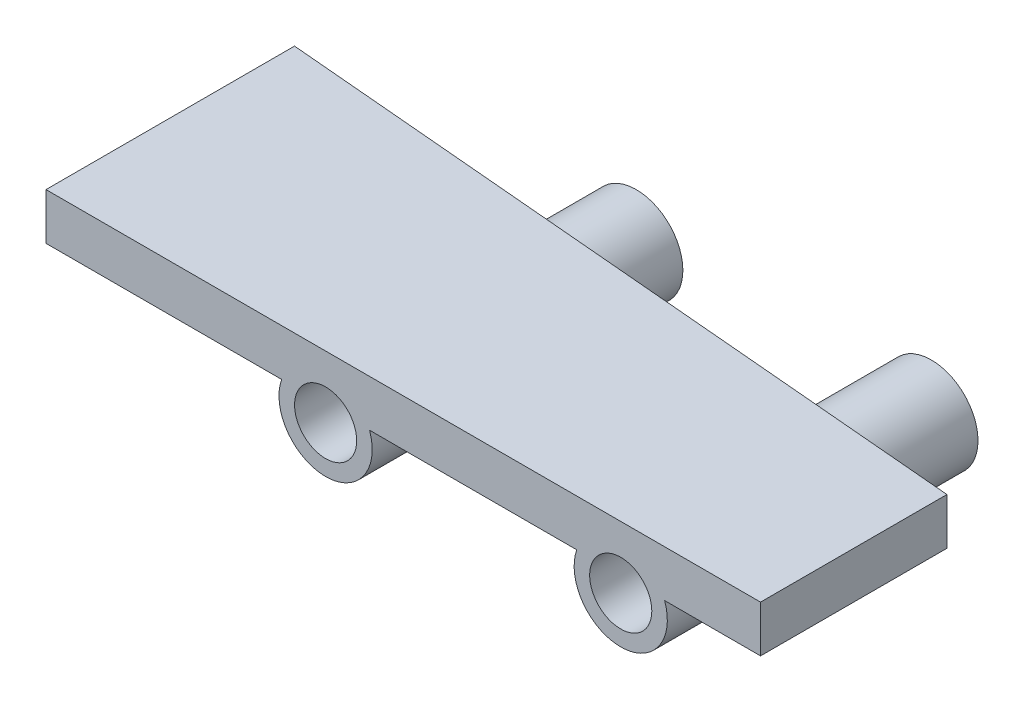
ISO-10303-21;
HEADER;
FILE_DESCRIPTION(('STEP AP214'),'2;1');
FILE_NAME('part.step','',(''),(''),'','','');
FILE_SCHEMA(('AUTOMOTIVE_DESIGN { 1 0 10303 214 1 1 1 1 }'));
ENDSEC;
DATA;
#1=APPLICATION_CONTEXT('core data for automotive mechanical design processes');
#2=APPLICATION_PROTOCOL_DEFINITION('international standard','automotive_design',2000,#1);
#3=PRODUCT_CONTEXT('',#1,'mechanical');
#4=PRODUCT('Part','Part','',(#3));
#5=PRODUCT_RELATED_PRODUCT_CATEGORY('part','',(#4));
#6=PRODUCT_DEFINITION_FORMATION('','',#4);
#7=PRODUCT_DEFINITION_CONTEXT('part definition',#1,'design');
#8=PRODUCT_DEFINITION('design','',#6,#7);
#9=PRODUCT_DEFINITION_SHAPE('','',#8);
#10=(LENGTH_UNIT() NAMED_UNIT(*) SI_UNIT(.MILLI.,.METRE.));
#11=(NAMED_UNIT(*) PLANE_ANGLE_UNIT() SI_UNIT($,.RADIAN.));
#12=(NAMED_UNIT(*) SI_UNIT($,.STERADIAN.) SOLID_ANGLE_UNIT());
#13=UNCERTAINTY_MEASURE_WITH_UNIT(LENGTH_MEASURE(1.E-05),#10,'distance_accuracy_value','');
#14=(GEOMETRIC_REPRESENTATION_CONTEXT(3) GLOBAL_UNCERTAINTY_ASSIGNED_CONTEXT((#13)) GLOBAL_UNIT_ASSIGNED_CONTEXT((#10,
#11,#12)) REPRESENTATION_CONTEXT('',''));
#15=CARTESIAN_POINT('',(0.,0.,0.));
#16=DIRECTION('',(0.,0.,1.));
#17=DIRECTION('',(1.,0.,0.));
#18=AXIS2_PLACEMENT_3D('',#15,#16,#17);
#19=CARTESIAN_POINT('',(234.95,-6.35,-127.));
#20=DIRECTION('',(0.,0.,1.));
#21=DIRECTION('',(1.,0.,0.));
#22=AXIS2_PLACEMENT_3D('',#19,#20,#21);
#23=CYLINDRICAL_SURFACE('',#22,19.05);
#24=CARTESIAN_POINT('',(234.95,-6.35,-127.));
#25=DIRECTION('',(0.,0.,1.));
#26=DIRECTION('',(1.,0.,0.));
#27=AXIS2_PLACEMENT_3D('',#24,#25,#26);
#28=CIRCLE('',#27,19.05);
#29=CARTESIAN_POINT('',(254.,-6.35,-127.));
#30=VERTEX_POINT('',#29);
#31=EDGE_CURVE('E254',#30,#30,#28,.T.);
#32=ORIENTED_EDGE('',*,*,#31,.T.);
#33=EDGE_LOOP('',(#32));
#34=FACE_BOUND('',#33,.T.);
#35=CARTESIAN_POINT('',(234.95,-6.35,-55.6737158202064));
#36=DIRECTION('',(-0.0866296163648421,0.,0.996240588195683));
#37=DIRECTION('',(0.996240588195683,0.,0.0866296163648421));
#38=AXIS2_PLACEMENT_3D('',#35,#36,#37);
#39=ELLIPSE('',#38,19.1218870478886,19.05);
#40=CARTESIAN_POINT('',(252.910512242138,0.,-54.111932146977));
#41=VERTEX_POINT('',#40);
#42=CARTESIAN_POINT('',(216.989487757862,0.,-57.2354994934358));
#43=VERTEX_POINT('',#42);
#44=EDGE_CURVE('E304',#41,#43,#39,.F.);
#45=ORIENTED_EDGE('',*,*,#44,.T.);
#46=DIRECTION('',(0.,0.,1.));
#47=VECTOR('',#46,1.);
#48=CARTESIAN_POINT('',(216.989487757862,0.,-127.));
#49=LINE('',#48,#47);
#50=CARTESIAN_POINT('',(216.989487757862,0.,-82.7313488906207));
#51=VERTEX_POINT('',#50);
#52=EDGE_CURVE('E193',#51,#43,#49,.T.);
#53=ORIENTED_EDGE('',*,*,#52,.F.);
#54=CARTESIAN_POINT('',(234.95,-6.35,-81.1695652173913));
#55=DIRECTION('',(0.086629616364842,0.,-0.996240588195683));
#56=DIRECTION('',(0.996240588195683,0.,0.086629616364842));
#57=AXIS2_PLACEMENT_3D('',#54,#55,#56);
#58=ELLIPSE('',#57,19.1218870478886,19.05);
#59=CARTESIAN_POINT('',(252.910512242138,0.,-79.6077815441619));
#60=VERTEX_POINT('',#59);
#61=EDGE_CURVE('E250',#51,#60,#58,.T.);
#62=ORIENTED_EDGE('',*,*,#61,.T.);
#63=DIRECTION('',(0.,0.,1.));
#64=VECTOR('',#63,1.);
#65=CARTESIAN_POINT('',(252.910512242138,0.,-127.));
#66=LINE('',#65,#64);
#67=EDGE_CURVE('E201',#41,#60,#66,.F.);
#68=ORIENTED_EDGE('',*,*,#67,.F.);
#69=EDGE_LOOP('',(#45,#53,#62,#68));
#70=FACE_BOUND('',#69,.T.);
#71=ADVANCED_FACE('F45',(#34,#70),#23,.T.);
#72=CARTESIAN_POINT('',(234.95,-6.35,-127.));
#73=DIRECTION('',(0.,0.,1.));
#74=DIRECTION('',(1.,0.,0.));
#75=AXIS2_PLACEMENT_3D('',#72,#73,#74);
#76=CYLINDRICAL_SURFACE('',#75,12.7);
#77=CARTESIAN_POINT('',(234.95,-6.35,-127.));
#78=DIRECTION('',(0.,0.,1.));
#79=DIRECTION('',(1.,0.,0.));
#80=AXIS2_PLACEMENT_3D('',#77,#78,#79);
#81=CIRCLE('',#80,12.7);
#82=CARTESIAN_POINT('',(247.65,-6.35,-127.));
#83=VERTEX_POINT('',#82);
#84=EDGE_CURVE('E259',#83,#83,#81,.T.);
#85=ORIENTED_EDGE('',*,*,#84,.F.);
#86=EDGE_LOOP('',(#85));
#87=FACE_BOUND('',#86,.T.);
#88=CARTESIAN_POINT('',(234.95,-6.35,0.));
#89=DIRECTION('',(0.,0.,1.));
#90=DIRECTION('',(1.,0.,0.));
#91=AXIS2_PLACEMENT_3D('',#88,#89,#90);
#92=CIRCLE('',#91,12.7);
#93=CARTESIAN_POINT('',(247.65,-6.35,0.));
#94=VERTEX_POINT('',#93);
#95=EDGE_CURVE('E263',#94,#94,#92,.T.);
#96=ORIENTED_EDGE('',*,*,#95,.T.);
#97=EDGE_LOOP('',(#96));
#98=FACE_BOUND('',#97,.T.);
#99=DIRECTION('',(0.,0.,1.));
#100=VECTOR('',#99,1.);
#101=CARTESIAN_POINT('',(245.948522628062,0.,-127.));
#102=LINE('',#101,#100);
#103=CARTESIAN_POINT('',(245.948522628062,0.,-25.4));
#104=VERTEX_POINT('',#103);
#105=CARTESIAN_POINT('',(245.948522628062,0.,-54.717322548201));
#106=VERTEX_POINT('',#105);
#107=EDGE_CURVE('E313',#104,#106,#102,.F.);
#108=ORIENTED_EDGE('',*,*,#107,.F.);
#109=CARTESIAN_POINT('',(234.95,-6.35,-25.4));
#110=DIRECTION('',(0.,0.,1.));
#111=DIRECTION('',(1.,0.,0.));
#112=AXIS2_PLACEMENT_3D('',#109,#110,#111);
#113=CIRCLE('',#112,12.7);
#114=CARTESIAN_POINT('',(223.951477371938,0.,-25.4));
#115=VERTEX_POINT('',#114);
#116=EDGE_CURVE('E298',#104,#115,#113,.F.);
#117=ORIENTED_EDGE('',*,*,#116,.T.);
#118=DIRECTION('',(0.,0.,1.));
#119=VECTOR('',#118,1.);
#120=CARTESIAN_POINT('',(223.951477371938,0.,-127.));
#121=LINE('',#120,#119);
#122=CARTESIAN_POINT('',(223.951477371938,0.,-56.6301090922118));
#123=VERTEX_POINT('',#122);
#124=EDGE_CURVE('E316',#123,#115,#121,.T.);
#125=ORIENTED_EDGE('',*,*,#124,.F.);
#126=CARTESIAN_POINT('',(234.95,-6.35,-55.6737158202064));
#127=DIRECTION('',(-0.0866296163648421,0.,0.996240588195683));
#128=DIRECTION('',(0.996240588195683,0.,0.0866296163648421));
#129=AXIS2_PLACEMENT_3D('',#126,#127,#128);
#130=ELLIPSE('',#129,12.7479246985924,12.7);
#131=EDGE_CURVE('E307',#106,#123,#130,.F.);
#132=ORIENTED_EDGE('',*,*,#131,.F.);
#133=EDGE_LOOP('',(#108,#117,#125,#132));
#134=FACE_BOUND('',#133,.T.);
#135=ADVANCED_FACE('F388',(#87,#98,#134),#76,.F.);
#136=CARTESIAN_POINT('',(114.3,-6.35,-127.));
#137=DIRECTION('',(0.,0.,1.));
#138=DIRECTION('',(1.,0.,0.));
#139=AXIS2_PLACEMENT_3D('',#136,#137,#138);
#140=CYLINDRICAL_SURFACE('',#139,19.05);
#141=CARTESIAN_POINT('',(114.3,-6.35,-127.));
#142=DIRECTION('',(0.,0.,1.));
#143=DIRECTION('',(1.,0.,0.));
#144=AXIS2_PLACEMENT_3D('',#141,#142,#143);
#145=CIRCLE('',#144,19.05);
#146=CARTESIAN_POINT('',(133.35,-6.35,-127.));
#147=VERTEX_POINT('',#146);
#148=EDGE_CURVE('E288',#147,#147,#145,.T.);
#149=ORIENTED_EDGE('',*,*,#148,.T.);
#150=EDGE_LOOP('',(#149));
#151=FACE_BOUND('',#150,.T.);
#152=CARTESIAN_POINT('',(114.3,-6.35,-66.1650201680325));
#153=DIRECTION('',(-0.0866296163648421,0.,0.996240588195683));
#154=DIRECTION('',(0.996240588195683,0.,0.0866296163648421));
#155=AXIS2_PLACEMENT_3D('',#152,#153,#154);
#156=ELLIPSE('',#155,19.1218870478887,19.05);
#157=CARTESIAN_POINT('',(132.260512242138,0.,-64.6032364948031));
#158=VERTEX_POINT('',#157);
#159=CARTESIAN_POINT('',(96.3394877578617,0.,-67.7268038412619));
#160=VERTEX_POINT('',#159);
#161=EDGE_CURVE('E310',#158,#160,#156,.F.);
#162=ORIENTED_EDGE('',*,*,#161,.T.);
#163=DIRECTION('',(0.,0.,1.));
#164=VECTOR('',#163,1.);
#165=CARTESIAN_POINT('',(96.3394877578617,0.,-127.));
#166=LINE('',#165,#164);
#167=CARTESIAN_POINT('',(96.3394877578617,0.,-93.2226532384468));
#168=VERTEX_POINT('',#167);
#169=EDGE_CURVE('E267',#168,#160,#166,.T.);
#170=ORIENTED_EDGE('',*,*,#169,.F.);
#171=CARTESIAN_POINT('',(114.3,-6.35,-91.6608695652174));
#172=DIRECTION('',(0.086629616364842,0.,-0.996240588195683));
#173=DIRECTION('',(0.996240588195683,0.,0.086629616364842));
#174=AXIS2_PLACEMENT_3D('',#171,#172,#173);
#175=ELLIPSE('',#174,19.1218870478887,19.05);
#176=CARTESIAN_POINT('',(132.260512242138,0.,-90.099085891988));
#177=VERTEX_POINT('',#176);
#178=EDGE_CURVE('E172',#168,#177,#175,.T.);
#179=ORIENTED_EDGE('',*,*,#178,.T.);
#180=DIRECTION('',(0.,0.,1.));
#181=VECTOR('',#180,1.);
#182=CARTESIAN_POINT('',(132.260512242138,0.,-127.));
#183=LINE('',#182,#181);
#184=EDGE_CURVE('E278',#158,#177,#183,.F.);
#185=ORIENTED_EDGE('',*,*,#184,.F.);
#186=EDGE_LOOP('',(#162,#170,#179,#185));
#187=FACE_BOUND('',#186,.T.);
#188=ADVANCED_FACE('F364',(#151,#187),#140,.T.);
#189=CARTESIAN_POINT('',(114.3,-6.35,-127.));
#190=DIRECTION('',(0.,0.,1.));
#191=DIRECTION('',(1.,0.,0.));
#192=AXIS2_PLACEMENT_3D('',#189,#190,#191);
#193=CYLINDRICAL_SURFACE('',#192,12.7);
#194=CARTESIAN_POINT('',(114.3,-6.35,-127.));
#195=DIRECTION('',(0.,0.,1.));
#196=DIRECTION('',(1.,0.,0.));
#197=AXIS2_PLACEMENT_3D('',#194,#195,#196);
#198=CIRCLE('',#197,12.7);
#199=CARTESIAN_POINT('',(127.,-6.35,-127.));
#200=VERTEX_POINT('',#199);
#201=EDGE_CURVE('E279',#200,#200,#198,.T.);
#202=ORIENTED_EDGE('',*,*,#201,.F.);
#203=EDGE_LOOP('',(#202));
#204=FACE_BOUND('',#203,.T.);
#205=CARTESIAN_POINT('',(114.3,-6.35,0.));
#206=DIRECTION('',(0.,0.,1.));
#207=DIRECTION('',(1.,0.,0.));
#208=AXIS2_PLACEMENT_3D('',#205,#206,#207);
#209=CIRCLE('',#208,12.7);
#210=CARTESIAN_POINT('',(127.,-6.35,0.));
#211=VERTEX_POINT('',#210);
#212=EDGE_CURVE('E283',#211,#211,#209,.T.);
#213=ORIENTED_EDGE('',*,*,#212,.T.);
#214=EDGE_LOOP('',(#213));
#215=FACE_BOUND('',#214,.T.);
#216=DIRECTION('',(0.,0.,1.));
#217=VECTOR('',#216,1.);
#218=CARTESIAN_POINT('',(125.298522628062,0.,-127.));
#219=LINE('',#218,#217);
#220=CARTESIAN_POINT('',(125.298522628062,0.,-25.4));
#221=VERTEX_POINT('',#220);
#222=CARTESIAN_POINT('',(125.298522628062,0.,-65.2086268960271));
#223=VERTEX_POINT('',#222);
#224=EDGE_CURVE('E11',#221,#223,#219,.F.);
#225=ORIENTED_EDGE('',*,*,#224,.F.);
#226=CARTESIAN_POINT('',(114.3,-6.35,-25.4));
#227=DIRECTION('',(0.,0.,1.));
#228=DIRECTION('',(1.,0.,0.));
#229=AXIS2_PLACEMENT_3D('',#226,#227,#228);
#230=CIRCLE('',#229,12.7);
#231=CARTESIAN_POINT('',(103.301477371938,0.,-25.4));
#232=VERTEX_POINT('',#231);
#233=EDGE_CURVE('E54',#221,#232,#230,.F.);
#234=ORIENTED_EDGE('',*,*,#233,.T.);
#235=DIRECTION('',(0.,0.,1.));
#236=VECTOR('',#235,1.);
#237=CARTESIAN_POINT('',(103.301477371938,0.,-127.));
#238=LINE('',#237,#236);
#239=CARTESIAN_POINT('',(103.301477371938,0.,-67.1214134400379));
#240=VERTEX_POINT('',#239);
#241=EDGE_CURVE('E158',#240,#232,#238,.T.);
#242=ORIENTED_EDGE('',*,*,#241,.F.);
#243=CARTESIAN_POINT('',(114.3,-6.35,-66.1650201680325));
#244=DIRECTION('',(-0.0866296163648421,0.,0.996240588195683));
#245=DIRECTION('',(0.996240588195683,0.,0.0866296163648421));
#246=AXIS2_PLACEMENT_3D('',#243,#244,#245);
#247=ELLIPSE('',#246,12.7479246985924,12.7);
#248=EDGE_CURVE('E171',#223,#240,#247,.F.);
#249=ORIENTED_EDGE('',*,*,#248,.F.);
#250=EDGE_LOOP('',(#225,#234,#242,#249));
#251=FACE_BOUND('',#250,.T.);
#252=ADVANCED_FACE('F185',(#204,#215,#251),#193,.F.);
#253=CARTESIAN_POINT('',(0.,0.,0.));
#254=DIRECTION('',(0.,1.,0.));
#255=DIRECTION('',(0.,0.,1.));
#256=AXIS2_PLACEMENT_3D('',#253,#254,#255);
#257=PLANE('',#256);
#258=DIRECTION('',(0.,0.,-1.));
#259=VECTOR('',#258,1.);
#260=CARTESIAN_POINT('',(0.,0.,0.));
#261=LINE('',#260,#259);
#262=CARTESIAN_POINT('',(0.,0.,0.));
#263=VERTEX_POINT('',#262);
#264=CARTESIAN_POINT('',(0.,0.,-101.6));
#265=VERTEX_POINT('',#264);
#266=EDGE_CURVE('E218',#263,#265,#261,.T.);
#267=ORIENTED_EDGE('',*,*,#266,.T.);
#268=DIRECTION('',(0.996240588195683,0.,0.086629616364842));
#269=VECTOR('',#268,1.);
#270=CARTESIAN_POINT('',(8.76848030018762,0.,-100.837523452158));
#271=LINE('',#270,#269);
#272=EDGE_CURVE('E222',#265,#168,#271,.T.);
#273=ORIENTED_EDGE('',*,*,#272,.T.);
#274=ORIENTED_EDGE('',*,*,#169,.T.);
#275=DIRECTION('',(0.996240588195683,0.,0.0866296163648421));
#276=VECTOR('',#275,1.);
#277=CARTESIAN_POINT('',(6.56808804452064,0.,-75.5330125119873));
#278=LINE('',#277,#276);
#279=EDGE_CURVE('E165',#160,#240,#278,.T.);
#280=ORIENTED_EDGE('',*,*,#279,.T.);
#281=ORIENTED_EDGE('',*,*,#241,.T.);
#282=DIRECTION('',(1.,0.,0.));
#283=VECTOR('',#282,1.);
#284=CARTESIAN_POINT('',(0.,0.,-25.4));
#285=LINE('',#284,#283);
#286=CARTESIAN_POINT('',(96.3394877578617,0.,-25.4));
#287=VERTEX_POINT('',#286);
#288=EDGE_CURVE('E161',#287,#232,#285,.T.);
#289=ORIENTED_EDGE('',*,*,#288,.F.);
#290=CARTESIAN_POINT('',(96.3394877578617,0.,0.));
#291=VERTEX_POINT('',#290);
#292=EDGE_CURVE('E273',#287,#291,#166,.T.);
#293=ORIENTED_EDGE('',*,*,#292,.T.);
#294=DIRECTION('',(1.,0.,0.));
#295=VECTOR('',#294,1.);
#296=CARTESIAN_POINT('',(0.,0.,0.));
#297=LINE('',#296,#295);
#298=EDGE_CURVE('E231',#263,#291,#297,.T.);
#299=ORIENTED_EDGE('',*,*,#298,.F.);
#300=EDGE_LOOP('',(#267,#273,#274,#280,#281,#289,#293,#299));
#301=FACE_BOUND('',#300,.T.);
#302=ADVANCED_FACE('F160',(#301),#257,.F.);
#303=CARTESIAN_POINT('',(132.260512242138,0.,0.));
#304=VERTEX_POINT('',#303);
#305=CARTESIAN_POINT('',(132.260512242138,0.,-25.4));
#306=VERTEX_POINT('',#305);
#307=EDGE_CURVE('E274',#304,#306,#183,.F.);
#308=ORIENTED_EDGE('',*,*,#307,.T.);
#309=EDGE_CURVE('E181',#221,#306,#285,.T.);
#310=ORIENTED_EDGE('',*,*,#309,.F.);
#311=ORIENTED_EDGE('',*,*,#224,.T.);
#312=EDGE_CURVE('E371',#223,#158,#278,.T.);
#313=ORIENTED_EDGE('',*,*,#312,.T.);
#314=ORIENTED_EDGE('',*,*,#184,.T.);
#315=EDGE_CURVE('E226',#177,#51,#271,.T.);
#316=ORIENTED_EDGE('',*,*,#315,.T.);
#317=ORIENTED_EDGE('',*,*,#52,.T.);
#318=EDGE_CURVE('E67',#43,#123,#278,.T.);
#319=ORIENTED_EDGE('',*,*,#318,.T.);
#320=ORIENTED_EDGE('',*,*,#124,.T.);
#321=CARTESIAN_POINT('',(216.989487757862,0.,-25.4));
#322=VERTEX_POINT('',#321);
#323=EDGE_CURVE('E61',#322,#115,#285,.T.);
#324=ORIENTED_EDGE('',*,*,#323,.F.);
#325=CARTESIAN_POINT('',(216.989487757862,0.,0.));
#326=VERTEX_POINT('',#325);
#327=EDGE_CURVE('E196',#322,#326,#49,.T.);
#328=ORIENTED_EDGE('',*,*,#327,.T.);
#329=EDGE_CURVE('E235',#304,#326,#297,.T.);
#330=ORIENTED_EDGE('',*,*,#329,.F.);
#331=EDGE_LOOP('',(#308,#310,#311,#313,#314,#316,#317,#319,#320,#324,#328,#330));
#332=FACE_BOUND('',#331,.T.);
#333=ADVANCED_FACE('F331',(#332),#257,.F.);
#334=CARTESIAN_POINT('',(0.,19.05,0.));
#335=DIRECTION('',(0.,0.,-1.));
#336=DIRECTION('',(-1.,0.,0.));
#337=AXIS2_PLACEMENT_3D('',#334,#335,#336);
#338=PLANE('',#337);
#339=ORIENTED_EDGE('',*,*,#212,.F.);
#340=EDGE_LOOP('',(#339));
#341=FACE_BOUND('',#340,.T.);
#342=ORIENTED_EDGE('',*,*,#298,.T.);
#343=CARTESIAN_POINT('',(114.3,-6.35,0.));
#344=DIRECTION('',(0.,0.,1.));
#345=DIRECTION('',(1.,0.,0.));
#346=AXIS2_PLACEMENT_3D('',#343,#344,#345);
#347=CIRCLE('',#346,19.05);
#348=EDGE_CURVE('E284',#291,#304,#347,.T.);
#349=ORIENTED_EDGE('',*,*,#348,.T.);
#350=ORIENTED_EDGE('',*,*,#329,.T.);
#351=CARTESIAN_POINT('',(234.95,-6.35,0.));
#352=DIRECTION('',(0.,0.,1.));
#353=DIRECTION('',(1.,0.,0.));
#354=AXIS2_PLACEMENT_3D('',#351,#352,#353);
#355=CIRCLE('',#354,19.05);
#356=CARTESIAN_POINT('',(252.910512242138,0.,0.));
#357=VERTEX_POINT('',#356);
#358=EDGE_CURVE('E255',#326,#357,#355,.T.);
#359=ORIENTED_EDGE('',*,*,#358,.T.);
#360=CARTESIAN_POINT('',(292.1,0.,0.));
#361=VERTEX_POINT('',#360);
#362=EDGE_CURVE('E236',#357,#361,#297,.T.);
#363=ORIENTED_EDGE('',*,*,#362,.T.);
#364=DIRECTION('',(0.,-1.,0.));
#365=VECTOR('',#364,1.);
#366=CARTESIAN_POINT('',(292.1,19.05,0.));
#367=LINE('',#366,#365);
#368=CARTESIAN_POINT('',(292.1,19.05,0.));
#369=VERTEX_POINT('',#368);
#370=EDGE_CURVE('E202',#369,#361,#367,.T.);
#371=ORIENTED_EDGE('',*,*,#370,.F.);
#372=DIRECTION('',(1.,0.,0.));
#373=VECTOR('',#372,1.);
#374=CARTESIAN_POINT('',(0.,19.05,0.));
#375=LINE('',#374,#373);
#376=CARTESIAN_POINT('',(0.,19.05,0.));
#377=VERTEX_POINT('',#376);
#378=EDGE_CURVE('E221',#377,#369,#375,.T.);
#379=ORIENTED_EDGE('',*,*,#378,.F.);
#380=DIRECTION('',(0.,-1.,0.));
#381=VECTOR('',#380,1.);
#382=CARTESIAN_POINT('',(0.,19.05,0.));
#383=LINE('',#382,#381);
#384=EDGE_CURVE('E214',#377,#263,#383,.T.);
#385=ORIENTED_EDGE('',*,*,#384,.T.);
#386=EDGE_LOOP('',(#342,#349,#350,#359,#363,#371,#379,#385));
#387=FACE_BOUND('',#386,.T.);
#388=ORIENTED_EDGE('',*,*,#95,.F.);
#389=EDGE_LOOP('',(#388));
#390=FACE_BOUND('',#389,.T.);
#391=ADVANCED_FACE('F47',(#341,#387,#390),#338,.F.);
#392=CARTESIAN_POINT('',(292.1,19.05,0.));
#393=DIRECTION('',(-1.,0.,0.));
#394=DIRECTION('',(0.,0.,1.));
#395=AXIS2_PLACEMENT_3D('',#392,#393,#394);
#396=PLANE('',#395);
#397=DIRECTION('',(0.,0.,-1.));
#398=VECTOR('',#397,1.);
#399=CARTESIAN_POINT('',(292.1,0.,0.));
#400=LINE('',#399,#398);
#401=CARTESIAN_POINT('',(292.1,0.,-76.2));
#402=VERTEX_POINT('',#401);
#403=EDGE_CURVE('E228',#361,#402,#400,.T.);
#404=ORIENTED_EDGE('',*,*,#403,.T.);
#405=DIRECTION('',(0.,-1.,0.));
#406=VECTOR('',#405,1.);
#407=CARTESIAN_POINT('',(292.1,19.05,-76.2));
#408=LINE('',#407,#406);
#409=CARTESIAN_POINT('',(292.1,19.05,-76.2));
#410=VERTEX_POINT('',#409);
#411=EDGE_CURVE('E206',#410,#402,#408,.T.);
#412=ORIENTED_EDGE('',*,*,#411,.F.);
#413=DIRECTION('',(0.,0.,-1.));
#414=VECTOR('',#413,1.);
#415=CARTESIAN_POINT('',(292.1,19.05,0.));
#416=LINE('',#415,#414);
#417=EDGE_CURVE('E244',#369,#410,#416,.T.);
#418=ORIENTED_EDGE('',*,*,#417,.F.);
#419=ORIENTED_EDGE('',*,*,#370,.T.);
#420=EDGE_LOOP('',(#404,#412,#418,#419));
#421=FACE_BOUND('',#420,.T.);
#422=ADVANCED_FACE('F349',(#421),#396,.F.);
#423=CARTESIAN_POINT('',(8.76848030018762,19.05,-100.837523452158));
#424=DIRECTION('',(0.086629616364842,0.,-0.996240588195683));
#425=DIRECTION('',(-0.996240588195683,0.,-0.086629616364842));
#426=AXIS2_PLACEMENT_3D('',#423,#424,#425);
#427=PLANE('',#426);
#428=ORIENTED_EDGE('',*,*,#178,.F.);
#429=ORIENTED_EDGE('',*,*,#272,.F.);
#430=DIRECTION('',(0.,-1.,0.));
#431=VECTOR('',#430,1.);
#432=CARTESIAN_POINT('',(0.,19.05,-101.6));
#433=LINE('',#432,#431);
#434=CARTESIAN_POINT('',(0.,19.05,-101.6));
#435=VERTEX_POINT('',#434);
#436=EDGE_CURVE('E210',#435,#265,#433,.T.);
#437=ORIENTED_EDGE('',*,*,#436,.F.);
#438=DIRECTION('',(0.996240588195683,0.,0.086629616364842));
#439=VECTOR('',#438,1.);
#440=CARTESIAN_POINT('',(8.76848030018762,19.05,-100.837523452158));
#441=LINE('',#440,#439);
#442=EDGE_CURVE('E240',#435,#410,#441,.T.);
#443=ORIENTED_EDGE('',*,*,#442,.T.);
#444=ORIENTED_EDGE('',*,*,#411,.T.);
#445=EDGE_CURVE('E227',#60,#402,#271,.T.);
#446=ORIENTED_EDGE('',*,*,#445,.F.);
#447=ORIENTED_EDGE('',*,*,#61,.F.);
#448=ORIENTED_EDGE('',*,*,#315,.F.);
#449=EDGE_LOOP('',(#428,#429,#437,#443,#444,#446,#447,#448));
#450=FACE_BOUND('',#449,.T.);
#451=ADVANCED_FACE('F361',(#450),#427,.T.);
#452=CARTESIAN_POINT('',(0.,19.05,0.));
#453=DIRECTION('',(-1.,0.,0.));
#454=DIRECTION('',(0.,0.,1.));
#455=AXIS2_PLACEMENT_3D('',#452,#453,#454);
#456=PLANE('',#455);
#457=ORIENTED_EDGE('',*,*,#266,.F.);
#458=ORIENTED_EDGE('',*,*,#384,.F.);
#459=DIRECTION('',(0.,0.,-1.));
#460=VECTOR('',#459,1.);
#461=CARTESIAN_POINT('',(0.,19.05,0.));
#462=LINE('',#461,#460);
#463=EDGE_CURVE('E217',#377,#435,#462,.T.);
#464=ORIENTED_EDGE('',*,*,#463,.T.);
#465=ORIENTED_EDGE('',*,*,#436,.T.);
#466=EDGE_LOOP('',(#457,#458,#464,#465));
#467=FACE_BOUND('',#466,.T.);
#468=ADVANCED_FACE('F357',(#467),#456,.T.);
#469=CARTESIAN_POINT('',(0.,19.05,0.));
#470=DIRECTION('',(0.,1.,0.));
#471=DIRECTION('',(0.,0.,1.));
#472=AXIS2_PLACEMENT_3D('',#469,#470,#471);
#473=PLANE('',#472);
#474=ORIENTED_EDGE('',*,*,#378,.T.);
#475=ORIENTED_EDGE('',*,*,#417,.T.);
#476=ORIENTED_EDGE('',*,*,#442,.F.);
#477=ORIENTED_EDGE('',*,*,#463,.F.);
#478=EDGE_LOOP('',(#474,#475,#476,#477));
#479=FACE_BOUND('',#478,.T.);
#480=ADVANCED_FACE('F353',(#479),#473,.T.);
#481=CARTESIAN_POINT('',(252.910512242138,0.,-25.4));
#482=VERTEX_POINT('',#481);
#483=EDGE_CURVE('E197',#357,#482,#66,.F.);
#484=ORIENTED_EDGE('',*,*,#483,.T.);
#485=EDGE_CURVE('E183',#104,#482,#285,.T.);
#486=ORIENTED_EDGE('',*,*,#485,.F.);
#487=ORIENTED_EDGE('',*,*,#107,.T.);
#488=EDGE_CURVE('E180',#106,#41,#278,.T.);
#489=ORIENTED_EDGE('',*,*,#488,.T.);
#490=ORIENTED_EDGE('',*,*,#67,.T.);
#491=ORIENTED_EDGE('',*,*,#445,.T.);
#492=ORIENTED_EDGE('',*,*,#403,.F.);
#493=ORIENTED_EDGE('',*,*,#362,.F.);
#494=EDGE_LOOP('',(#484,#486,#487,#489,#490,#491,#492,#493));
#495=FACE_BOUND('',#494,.T.);
#496=ADVANCED_FACE('F345',(#495),#257,.F.);
#497=CARTESIAN_POINT('',(234.95,-6.35,-25.4));
#498=DIRECTION('',(0.,0.,1.));
#499=DIRECTION('',(1.,0.,0.));
#500=AXIS2_PLACEMENT_3D('',#497,#498,#499);
#501=CIRCLE('',#500,19.05);
#502=EDGE_CURVE('E292',#482,#322,#501,.F.);
#503=ORIENTED_EDGE('',*,*,#502,.F.);
#504=ORIENTED_EDGE('',*,*,#483,.F.);
#505=ORIENTED_EDGE('',*,*,#358,.F.);
#506=ORIENTED_EDGE('',*,*,#327,.F.);
#507=EDGE_LOOP('',(#503,#504,#505,#506));
#508=FACE_BOUND('',#507,.T.);
#509=ADVANCED_FACE('F391',(#508),#23,.T.);
#510=CARTESIAN_POINT('',(234.95,-6.35,-127.));
#511=DIRECTION('',(0.,0.,1.));
#512=DIRECTION('',(1.,0.,0.));
#513=AXIS2_PLACEMENT_3D('',#510,#511,#512);
#514=PLANE('',#513);
#515=ORIENTED_EDGE('',*,*,#84,.T.);
#516=EDGE_LOOP('',(#515));
#517=FACE_BOUND('',#516,.T.);
#518=ORIENTED_EDGE('',*,*,#31,.F.);
#519=EDGE_LOOP('',(#518));
#520=FACE_BOUND('',#519,.T.);
#521=ADVANCED_FACE('F396',(#517,#520),#514,.F.);
#522=ORIENTED_EDGE('',*,*,#292,.F.);
#523=CARTESIAN_POINT('',(114.3,-6.35,-25.4));
#524=DIRECTION('',(0.,0.,1.));
#525=DIRECTION('',(1.,0.,0.));
#526=AXIS2_PLACEMENT_3D('',#523,#524,#525);
#527=CIRCLE('',#526,19.05);
#528=EDGE_CURVE('E178',#306,#287,#527,.F.);
#529=ORIENTED_EDGE('',*,*,#528,.F.);
#530=ORIENTED_EDGE('',*,*,#307,.F.);
#531=ORIENTED_EDGE('',*,*,#348,.F.);
#532=EDGE_LOOP('',(#522,#529,#530,#531));
#533=FACE_BOUND('',#532,.T.);
#534=ADVANCED_FACE('F328',(#533),#140,.T.);
#535=CARTESIAN_POINT('',(114.3,-6.35,-127.));
#536=DIRECTION('',(0.,0.,1.));
#537=DIRECTION('',(1.,0.,0.));
#538=AXIS2_PLACEMENT_3D('',#535,#536,#537);
#539=PLANE('',#538);
#540=ORIENTED_EDGE('',*,*,#201,.T.);
#541=EDGE_LOOP('',(#540));
#542=FACE_BOUND('',#541,.T.);
#543=ORIENTED_EDGE('',*,*,#148,.F.);
#544=EDGE_LOOP('',(#543));
#545=FACE_BOUND('',#544,.T.);
#546=ADVANCED_FACE('F427',(#542,#545),#539,.F.);
#547=CARTESIAN_POINT('',(6.56808804452064,-25.4,-75.5330125119873));
#548=DIRECTION('',(-0.0866296163648421,0.,0.996240588195683));
#549=DIRECTION('',(0.996240588195683,0.,0.0866296163648421));
#550=AXIS2_PLACEMENT_3D('',#547,#548,#549);
#551=PLANE('',#550);
#552=ORIENTED_EDGE('',*,*,#161,.F.);
#553=ORIENTED_EDGE('',*,*,#312,.F.);
#554=ORIENTED_EDGE('',*,*,#248,.T.);
#555=ORIENTED_EDGE('',*,*,#279,.F.);
#556=EDGE_LOOP('',(#552,#553,#554,#555));
#557=FACE_BOUND('',#556,.T.);
#558=ADVANCED_FACE('F369',(#557),#551,.T.);
#559=CARTESIAN_POINT('',(0.,-25.4,-25.4));
#560=DIRECTION('',(0.,0.,1.));
#561=DIRECTION('',(1.,0.,0.));
#562=AXIS2_PLACEMENT_3D('',#559,#560,#561);
#563=PLANE('',#562);
#564=ORIENTED_EDGE('',*,*,#528,.T.);
#565=ORIENTED_EDGE('',*,*,#288,.T.);
#566=ORIENTED_EDGE('',*,*,#233,.F.);
#567=ORIENTED_EDGE('',*,*,#309,.T.);
#568=EDGE_LOOP('',(#564,#565,#566,#567));
#569=FACE_BOUND('',#568,.T.);
#570=ADVANCED_FACE('F175',(#569),#563,.F.);
#571=ORIENTED_EDGE('',*,*,#502,.T.);
#572=ORIENTED_EDGE('',*,*,#323,.T.);
#573=ORIENTED_EDGE('',*,*,#116,.F.);
#574=ORIENTED_EDGE('',*,*,#485,.T.);
#575=EDGE_LOOP('',(#571,#572,#573,#574));
#576=FACE_BOUND('',#575,.T.);
#577=ADVANCED_FACE('F389',(#576),#563,.F.);
#578=ORIENTED_EDGE('',*,*,#44,.F.);
#579=ORIENTED_EDGE('',*,*,#488,.F.);
#580=ORIENTED_EDGE('',*,*,#131,.T.);
#581=ORIENTED_EDGE('',*,*,#318,.F.);
#582=EDGE_LOOP('',(#578,#579,#580,#581));
#583=FACE_BOUND('',#582,.T.);
#584=ADVANCED_FACE('F383',(#583),#551,.T.);
#585=CLOSED_SHELL('',(#71,#135,#188,#252,#302,#333,#391,#422,#451,#468,#480,#496,#509,#521,#534,
#546,#558,#570,#577,#584));
#586=MANIFOLD_SOLID_BREP('B2',#585);
#587=ADVANCED_BREP_SHAPE_REPRESENTATION('',(#18,#586),#14);
#588=SHAPE_DEFINITION_REPRESENTATION(#9,#587);
ENDSEC;
END-ISO-10303-21;
